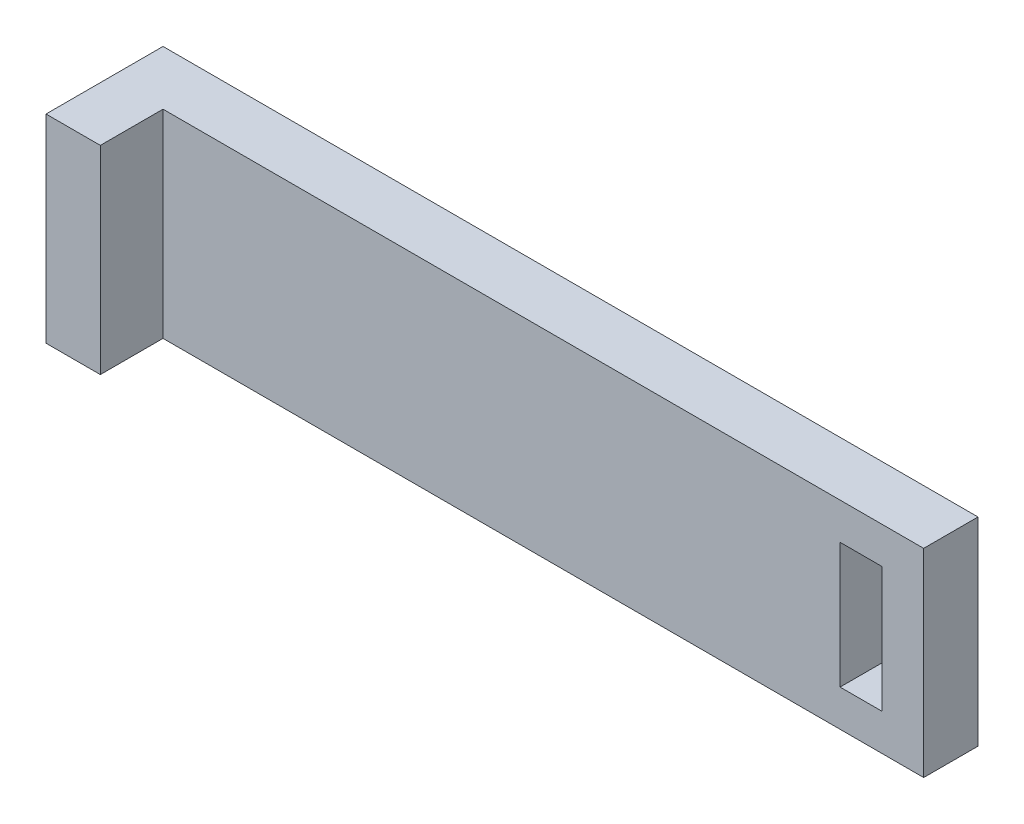
ISO-10303-21;
HEADER;
FILE_DESCRIPTION(('STEP AP214'),'2;1');
FILE_NAME('part.step','',(''),(''),'','','');
FILE_SCHEMA(('AUTOMOTIVE_DESIGN { 1 0 10303 214 1 1 1 1 }'));
ENDSEC;
DATA;
#1=APPLICATION_CONTEXT('core data for automotive mechanical design processes');
#2=APPLICATION_PROTOCOL_DEFINITION('international standard','automotive_design',2000,#1);
#3=PRODUCT_CONTEXT('',#1,'mechanical');
#4=PRODUCT('Part','Part','',(#3));
#5=PRODUCT_RELATED_PRODUCT_CATEGORY('part','',(#4));
#6=PRODUCT_DEFINITION_FORMATION('','',#4);
#7=PRODUCT_DEFINITION_CONTEXT('part definition',#1,'design');
#8=PRODUCT_DEFINITION('design','',#6,#7);
#9=PRODUCT_DEFINITION_SHAPE('','',#8);
#10=(LENGTH_UNIT() NAMED_UNIT(*) SI_UNIT(.MILLI.,.METRE.));
#11=(NAMED_UNIT(*) PLANE_ANGLE_UNIT() SI_UNIT($,.RADIAN.));
#12=(NAMED_UNIT(*) SI_UNIT($,.STERADIAN.) SOLID_ANGLE_UNIT());
#13=UNCERTAINTY_MEASURE_WITH_UNIT(LENGTH_MEASURE(1.E-05),#10,'distance_accuracy_value','');
#14=(GEOMETRIC_REPRESENTATION_CONTEXT(3) GLOBAL_UNCERTAINTY_ASSIGNED_CONTEXT((#13)) GLOBAL_UNIT_ASSIGNED_CONTEXT((#10,
#11,#12)) REPRESENTATION_CONTEXT('',''));
#15=CARTESIAN_POINT('',(0.,0.,0.));
#16=DIRECTION('',(0.,0.,1.));
#17=DIRECTION('',(1.,0.,0.));
#18=AXIS2_PLACEMENT_3D('',#15,#16,#17);
#19=CARTESIAN_POINT('',(-32.6418439716312,18.0585106382979,2.6));
#20=DIRECTION('',(1.,0.,0.));
#21=DIRECTION('',(0.,0.,-1.));
#22=AXIS2_PLACEMENT_3D('',#19,#20,#21);
#23=PLANE('',#22);
#24=DIRECTION('',(0.,-1.,0.));
#25=VECTOR('',#24,1.);
#26=CARTESIAN_POINT('',(-32.6418439716312,18.0585106382979,0.));
#27=LINE('',#26,#25);
#28=CARTESIAN_POINT('',(-32.6418439716312,18.0585106382979,0.));
#29=VERTEX_POINT('',#28);
#30=CARTESIAN_POINT('',(-32.6418439716312,8.55851063829788,0.));
#31=VERTEX_POINT('',#30);
#32=EDGE_CURVE('E168',#29,#31,#27,.T.);
#33=ORIENTED_EDGE('',*,*,#32,.T.);
#34=DIRECTION('',(0.,0.,-1.));
#35=VECTOR('',#34,1.);
#36=CARTESIAN_POINT('',(-32.6418439716312,8.55851063829788,2.6));
#37=LINE('',#36,#35);
#38=CARTESIAN_POINT('',(-32.6418439716312,8.55851063829788,5.6));
#39=VERTEX_POINT('',#38);
#40=EDGE_CURVE('E11',#39,#31,#37,.T.);
#41=ORIENTED_EDGE('',*,*,#40,.F.);
#42=DIRECTION('',(0.,-1.,0.));
#43=VECTOR('',#42,1.);
#44=CARTESIAN_POINT('',(-32.6418439716312,18.0585106382979,5.6));
#45=LINE('',#44,#43);
#46=CARTESIAN_POINT('',(-32.6418439716312,18.0585106382979,5.6));
#47=VERTEX_POINT('',#46);
#48=EDGE_CURVE('E150',#47,#39,#45,.T.);
#49=ORIENTED_EDGE('',*,*,#48,.F.);
#50=DIRECTION('',(0.,0.,-1.));
#51=VECTOR('',#50,1.);
#52=CARTESIAN_POINT('',(-32.6418439716312,18.0585106382979,2.6));
#53=LINE('',#52,#51);
#54=EDGE_CURVE('E176',#47,#29,#53,.T.);
#55=ORIENTED_EDGE('',*,*,#54,.T.);
#56=EDGE_LOOP('',(#33,#41,#49,#55));
#57=FACE_BOUND('',#56,.T.);
#58=ADVANCED_FACE('F38',(#57),#23,.F.);
#59=CARTESIAN_POINT('',(-32.6418439716312,8.55851063829788,2.6));
#60=DIRECTION('',(0.,1.,0.));
#61=DIRECTION('',(0.,0.,1.));
#62=AXIS2_PLACEMENT_3D('',#59,#60,#61);
#63=PLANE('',#62);
#64=DIRECTION('',(1.,0.,0.));
#65=VECTOR('',#64,1.);
#66=CARTESIAN_POINT('',(-32.6418439716312,8.55851063829788,0.));
#67=LINE('',#66,#65);
#68=CARTESIAN_POINT('',(6.35815602836879,8.55851063829788,0.));
#69=VERTEX_POINT('',#68);
#70=EDGE_CURVE('E179',#31,#69,#67,.T.);
#71=ORIENTED_EDGE('',*,*,#70,.T.);
#72=DIRECTION('',(0.,0.,-1.));
#73=VECTOR('',#72,1.);
#74=CARTESIAN_POINT('',(6.35815602836879,8.55851063829788,2.6));
#75=LINE('',#74,#73);
#76=CARTESIAN_POINT('',(6.35815602836879,8.55851063829788,2.6));
#77=VERTEX_POINT('',#76);
#78=EDGE_CURVE('E45',#77,#69,#75,.T.);
#79=ORIENTED_EDGE('',*,*,#78,.F.);
#80=DIRECTION('',(1.,0.,0.));
#81=VECTOR('',#80,1.);
#82=CARTESIAN_POINT('',(-32.6418439716312,8.55851063829788,2.6));
#83=LINE('',#82,#81);
#84=CARTESIAN_POINT('',(-30.0418439716312,8.55851063829788,2.6));
#85=VERTEX_POINT('',#84);
#86=EDGE_CURVE('E169',#85,#77,#83,.T.);
#87=ORIENTED_EDGE('',*,*,#86,.F.);
#88=DIRECTION('',(0.,0.,-1.));
#89=VECTOR('',#88,1.);
#90=CARTESIAN_POINT('',(-30.0418439716312,8.55851063829788,5.6));
#91=LINE('',#90,#89);
#92=CARTESIAN_POINT('',(-30.0418439716312,8.55851063829788,5.6));
#93=VERTEX_POINT('',#92);
#94=EDGE_CURVE('E165',#93,#85,#91,.T.);
#95=ORIENTED_EDGE('',*,*,#94,.F.);
#96=DIRECTION('',(1.,0.,0.));
#97=VECTOR('',#96,1.);
#98=CARTESIAN_POINT('',(-32.6418439716312,8.55851063829788,5.6));
#99=LINE('',#98,#97);
#100=EDGE_CURVE('E153',#39,#93,#99,.T.);
#101=ORIENTED_EDGE('',*,*,#100,.F.);
#102=ORIENTED_EDGE('',*,*,#40,.T.);
#103=EDGE_LOOP('',(#71,#79,#87,#95,#101,#102));
#104=FACE_BOUND('',#103,.T.);
#105=ADVANCED_FACE('F215',(#104),#63,.F.);
#106=CARTESIAN_POINT('',(6.35815602836879,18.0585106382979,2.6));
#107=DIRECTION('',(-1.,0.,0.));
#108=DIRECTION('',(0.,0.,1.));
#109=AXIS2_PLACEMENT_3D('',#106,#107,#108);
#110=PLANE('',#109);
#111=DIRECTION('',(0.,1.,0.));
#112=VECTOR('',#111,1.);
#113=CARTESIAN_POINT('',(6.35815602836879,18.0585106382979,0.));
#114=LINE('',#113,#112);
#115=CARTESIAN_POINT('',(6.35815602836879,18.0585106382979,0.));
#116=VERTEX_POINT('',#115);
#117=EDGE_CURVE('E181',#69,#116,#114,.T.);
#118=ORIENTED_EDGE('',*,*,#117,.T.);
#119=DIRECTION('',(0.,0.,-1.));
#120=VECTOR('',#119,1.);
#121=CARTESIAN_POINT('',(6.35815602836879,18.0585106382979,2.6));
#122=LINE('',#121,#120);
#123=CARTESIAN_POINT('',(6.35815602836879,18.0585106382979,2.6));
#124=VERTEX_POINT('',#123);
#125=EDGE_CURVE('E186',#124,#116,#122,.T.);
#126=ORIENTED_EDGE('',*,*,#125,.F.);
#127=DIRECTION('',(0.,1.,0.));
#128=VECTOR('',#127,1.);
#129=CARTESIAN_POINT('',(6.35815602836879,18.0585106382979,2.6));
#130=LINE('',#129,#128);
#131=EDGE_CURVE('E171',#77,#124,#130,.T.);
#132=ORIENTED_EDGE('',*,*,#131,.F.);
#133=ORIENTED_EDGE('',*,*,#78,.T.);
#134=EDGE_LOOP('',(#118,#126,#132,#133));
#135=FACE_BOUND('',#134,.T.);
#136=ADVANCED_FACE('F193',(#135),#110,.F.);
#137=CARTESIAN_POINT('',(-32.6418439716312,18.0585106382979,2.6));
#138=DIRECTION('',(0.,-1.,0.));
#139=DIRECTION('',(0.,0.,-1.));
#140=AXIS2_PLACEMENT_3D('',#137,#138,#139);
#141=PLANE('',#140);
#142=DIRECTION('',(-1.,0.,0.));
#143=VECTOR('',#142,1.);
#144=CARTESIAN_POINT('',(-32.6418439716312,18.0585106382979,0.));
#145=LINE('',#144,#143);
#146=EDGE_CURVE('E172',#116,#29,#145,.T.);
#147=ORIENTED_EDGE('',*,*,#146,.T.);
#148=ORIENTED_EDGE('',*,*,#54,.F.);
#149=DIRECTION('',(-1.,0.,0.));
#150=VECTOR('',#149,1.);
#151=CARTESIAN_POINT('',(-32.6418439716312,18.0585106382979,5.6));
#152=LINE('',#151,#150);
#153=CARTESIAN_POINT('',(-30.0418439716312,18.0585106382979,5.6));
#154=VERTEX_POINT('',#153);
#155=EDGE_CURVE('E157',#154,#47,#152,.T.);
#156=ORIENTED_EDGE('',*,*,#155,.F.);
#157=DIRECTION('',(0.,0.,-1.));
#158=VECTOR('',#157,1.);
#159=CARTESIAN_POINT('',(-30.0418439716312,18.0585106382979,5.6));
#160=LINE('',#159,#158);
#161=CARTESIAN_POINT('',(-30.0418439716312,18.0585106382979,2.6));
#162=VERTEX_POINT('',#161);
#163=EDGE_CURVE('E160',#154,#162,#160,.T.);
#164=ORIENTED_EDGE('',*,*,#163,.T.);
#165=DIRECTION('',(-1.,0.,0.));
#166=VECTOR('',#165,1.);
#167=CARTESIAN_POINT('',(-32.6418439716312,18.0585106382979,2.6));
#168=LINE('',#167,#166);
#169=EDGE_CURVE('E174',#124,#162,#168,.T.);
#170=ORIENTED_EDGE('',*,*,#169,.F.);
#171=ORIENTED_EDGE('',*,*,#125,.T.);
#172=EDGE_LOOP('',(#147,#148,#156,#164,#170,#171));
#173=FACE_BOUND('',#172,.T.);
#174=ADVANCED_FACE('F200',(#173),#141,.F.);
#175=CARTESIAN_POINT('',(0.,0.,2.6));
#176=DIRECTION('',(0.,0.,1.));
#177=DIRECTION('',(1.,0.,0.));
#178=AXIS2_PLACEMENT_3D('',#175,#176,#177);
#179=PLANE('',#178);
#180=DIRECTION('',(0.,-1.,0.));
#181=VECTOR('',#180,1.);
#182=CARTESIAN_POINT('',(2.35815602836879,0.,2.6));
#183=LINE('',#182,#181);
#184=CARTESIAN_POINT('',(2.35815602836879,16.3085106382979,2.6));
#185=VERTEX_POINT('',#184);
#186=CARTESIAN_POINT('',(2.35815602836879,10.3085106382979,2.6));
#187=VERTEX_POINT('',#186);
#188=EDGE_CURVE('E147',#185,#187,#183,.T.);
#189=ORIENTED_EDGE('',*,*,#188,.F.);
#190=DIRECTION('',(-1.,0.,0.));
#191=VECTOR('',#190,1.);
#192=CARTESIAN_POINT('',(0.,16.3085106382979,2.6));
#193=LINE('',#192,#191);
#194=CARTESIAN_POINT('',(4.35815602836879,16.3085106382979,2.6));
#195=VERTEX_POINT('',#194);
#196=EDGE_CURVE('E140',#195,#185,#193,.T.);
#197=ORIENTED_EDGE('',*,*,#196,.F.);
#198=DIRECTION('',(0.,1.,0.));
#199=VECTOR('',#198,1.);
#200=CARTESIAN_POINT('',(4.35815602836879,0.,2.6));
#201=LINE('',#200,#199);
#202=CARTESIAN_POINT('',(4.35815602836879,10.3085106382979,2.6));
#203=VERTEX_POINT('',#202);
#204=EDGE_CURVE('E120',#203,#195,#201,.T.);
#205=ORIENTED_EDGE('',*,*,#204,.F.);
#206=DIRECTION('',(1.,0.,0.));
#207=VECTOR('',#206,1.);
#208=CARTESIAN_POINT('',(0.,10.3085106382979,2.6));
#209=LINE('',#208,#207);
#210=EDGE_CURVE('E145',#187,#203,#209,.T.);
#211=ORIENTED_EDGE('',*,*,#210,.F.);
#212=EDGE_LOOP('',(#189,#197,#205,#211));
#213=FACE_BOUND('',#212,.T.);
#214=DIRECTION('',(0.,1.,0.));
#215=VECTOR('',#214,1.);
#216=CARTESIAN_POINT('',(-30.0418439716312,18.0585106382979,2.6));
#217=LINE('',#216,#215);
#218=EDGE_CURVE('E149',#85,#162,#217,.T.);
#219=ORIENTED_EDGE('',*,*,#218,.F.);
#220=ORIENTED_EDGE('',*,*,#86,.T.);
#221=ORIENTED_EDGE('',*,*,#131,.T.);
#222=ORIENTED_EDGE('',*,*,#169,.T.);
#223=EDGE_LOOP('',(#219,#220,#221,#222));
#224=FACE_BOUND('',#223,.T.);
#225=ADVANCED_FACE('F214',(#213,#224),#179,.T.);
#226=CARTESIAN_POINT('',(0.,0.,0.));
#227=DIRECTION('',(0.,0.,1.));
#228=DIRECTION('',(1.,0.,0.));
#229=AXIS2_PLACEMENT_3D('',#226,#227,#228);
#230=PLANE('',#229);
#231=DIRECTION('',(1.,0.,0.));
#232=VECTOR('',#231,1.);
#233=CARTESIAN_POINT('',(2.35815602836879,16.3085106382979,0.));
#234=LINE('',#233,#232);
#235=CARTESIAN_POINT('',(2.35815602836879,16.3085106382979,0.));
#236=VERTEX_POINT('',#235);
#237=CARTESIAN_POINT('',(4.35815602836879,16.3085106382979,0.));
#238=VERTEX_POINT('',#237);
#239=EDGE_CURVE('E126',#236,#238,#234,.T.);
#240=ORIENTED_EDGE('',*,*,#239,.F.);
#241=DIRECTION('',(0.,1.,0.));
#242=VECTOR('',#241,1.);
#243=CARTESIAN_POINT('',(2.35815602836879,10.3085106382979,0.));
#244=LINE('',#243,#242);
#245=CARTESIAN_POINT('',(2.35815602836879,10.3085106382979,0.));
#246=VERTEX_POINT('',#245);
#247=EDGE_CURVE('E60',#246,#236,#244,.T.);
#248=ORIENTED_EDGE('',*,*,#247,.F.);
#249=DIRECTION('',(-1.,0.,0.));
#250=VECTOR('',#249,1.);
#251=CARTESIAN_POINT('',(2.35815602836879,10.3085106382979,0.));
#252=LINE('',#251,#250);
#253=CARTESIAN_POINT('',(4.35815602836879,10.3085106382979,0.));
#254=VERTEX_POINT('',#253);
#255=EDGE_CURVE('E133',#254,#246,#252,.T.);
#256=ORIENTED_EDGE('',*,*,#255,.F.);
#257=DIRECTION('',(0.,-1.,0.));
#258=VECTOR('',#257,1.);
#259=CARTESIAN_POINT('',(4.35815602836879,10.3085106382979,0.));
#260=LINE('',#259,#258);
#261=EDGE_CURVE('E117',#238,#254,#260,.T.);
#262=ORIENTED_EDGE('',*,*,#261,.F.);
#263=EDGE_LOOP('',(#240,#248,#256,#262));
#264=FACE_BOUND('',#263,.T.);
#265=ORIENTED_EDGE('',*,*,#32,.F.);
#266=ORIENTED_EDGE('',*,*,#146,.F.);
#267=ORIENTED_EDGE('',*,*,#117,.F.);
#268=ORIENTED_EDGE('',*,*,#70,.F.);
#269=EDGE_LOOP('',(#265,#266,#267,#268));
#270=FACE_BOUND('',#269,.T.);
#271=ADVANCED_FACE('F130',(#264,#270),#230,.F.);
#272=CARTESIAN_POINT('',(-30.0418439716312,18.0585106382979,5.6));
#273=DIRECTION('',(-1.,0.,0.));
#274=DIRECTION('',(0.,0.,1.));
#275=AXIS2_PLACEMENT_3D('',#272,#273,#274);
#276=PLANE('',#275);
#277=ORIENTED_EDGE('',*,*,#218,.T.);
#278=ORIENTED_EDGE('',*,*,#163,.F.);
#279=DIRECTION('',(0.,1.,0.));
#280=VECTOR('',#279,1.);
#281=CARTESIAN_POINT('',(-30.0418439716312,18.0585106382979,5.6));
#282=LINE('',#281,#280);
#283=EDGE_CURVE('E155',#93,#154,#282,.T.);
#284=ORIENTED_EDGE('',*,*,#283,.F.);
#285=ORIENTED_EDGE('',*,*,#94,.T.);
#286=EDGE_LOOP('',(#277,#278,#284,#285));
#287=FACE_BOUND('',#286,.T.);
#288=ADVANCED_FACE('F212',(#287),#276,.F.);
#289=CARTESIAN_POINT('',(0.,0.,5.6));
#290=DIRECTION('',(0.,0.,1.));
#291=DIRECTION('',(1.,0.,0.));
#292=AXIS2_PLACEMENT_3D('',#289,#290,#291);
#293=PLANE('',#292);
#294=ORIENTED_EDGE('',*,*,#48,.T.);
#295=ORIENTED_EDGE('',*,*,#100,.T.);
#296=ORIENTED_EDGE('',*,*,#283,.T.);
#297=ORIENTED_EDGE('',*,*,#155,.T.);
#298=EDGE_LOOP('',(#294,#295,#296,#297));
#299=FACE_BOUND('',#298,.T.);
#300=ADVANCED_FACE('F207',(#299),#293,.T.);
#301=CARTESIAN_POINT('',(2.35815602836879,10.3085106382979,4.));
#302=DIRECTION('',(-1.,0.,0.));
#303=DIRECTION('',(0.,0.,1.));
#304=AXIS2_PLACEMENT_3D('',#301,#302,#303);
#305=PLANE('',#304);
#306=ORIENTED_EDGE('',*,*,#188,.T.);
#307=DIRECTION('',(0.,0.,-1.));
#308=VECTOR('',#307,1.);
#309=CARTESIAN_POINT('',(2.35815602836879,10.3085106382979,4.));
#310=LINE('',#309,#308);
#311=EDGE_CURVE('E138',#187,#246,#310,.T.);
#312=ORIENTED_EDGE('',*,*,#311,.T.);
#313=ORIENTED_EDGE('',*,*,#247,.T.);
#314=DIRECTION('',(0.,0.,-1.));
#315=VECTOR('',#314,1.);
#316=CARTESIAN_POINT('',(2.35815602836879,16.3085106382979,4.));
#317=LINE('',#316,#315);
#318=EDGE_CURVE('E123',#185,#236,#317,.T.);
#319=ORIENTED_EDGE('',*,*,#318,.F.);
#320=EDGE_LOOP('',(#306,#312,#313,#319));
#321=FACE_BOUND('',#320,.T.);
#322=ADVANCED_FACE('F234',(#321),#305,.F.);
#323=CARTESIAN_POINT('',(2.35815602836879,10.3085106382979,4.));
#324=DIRECTION('',(0.,-1.,0.));
#325=DIRECTION('',(0.,0.,-1.));
#326=AXIS2_PLACEMENT_3D('',#323,#324,#325);
#327=PLANE('',#326);
#328=ORIENTED_EDGE('',*,*,#210,.T.);
#329=DIRECTION('',(0.,0.,-1.));
#330=VECTOR('',#329,1.);
#331=CARTESIAN_POINT('',(4.35815602836879,10.3085106382979,4.));
#332=LINE('',#331,#330);
#333=EDGE_CURVE('E122',#203,#254,#332,.T.);
#334=ORIENTED_EDGE('',*,*,#333,.T.);
#335=ORIENTED_EDGE('',*,*,#255,.T.);
#336=ORIENTED_EDGE('',*,*,#311,.F.);
#337=EDGE_LOOP('',(#328,#334,#335,#336));
#338=FACE_BOUND('',#337,.T.);
#339=ADVANCED_FACE('F237',(#338),#327,.F.);
#340=CARTESIAN_POINT('',(4.35815602836879,10.3085106382979,4.));
#341=DIRECTION('',(1.,0.,0.));
#342=DIRECTION('',(0.,1.,0.));
#343=AXIS2_PLACEMENT_3D('',#340,#341,#342);
#344=PLANE('',#343);
#345=ORIENTED_EDGE('',*,*,#204,.T.);
#346=DIRECTION('',(0.,0.,-1.));
#347=VECTOR('',#346,1.);
#348=CARTESIAN_POINT('',(4.35815602836879,16.3085106382979,4.));
#349=LINE('',#348,#347);
#350=EDGE_CURVE('E52',#195,#238,#349,.T.);
#351=ORIENTED_EDGE('',*,*,#350,.T.);
#352=ORIENTED_EDGE('',*,*,#261,.T.);
#353=ORIENTED_EDGE('',*,*,#333,.F.);
#354=EDGE_LOOP('',(#345,#351,#352,#353));
#355=FACE_BOUND('',#354,.T.);
#356=ADVANCED_FACE('F114',(#355),#344,.F.);
#357=CARTESIAN_POINT('',(2.35815602836879,16.3085106382979,4.));
#358=DIRECTION('',(0.,1.,0.));
#359=DIRECTION('',(0.,0.,1.));
#360=AXIS2_PLACEMENT_3D('',#357,#358,#359);
#361=PLANE('',#360);
#362=ORIENTED_EDGE('',*,*,#196,.T.);
#363=ORIENTED_EDGE('',*,*,#318,.T.);
#364=ORIENTED_EDGE('',*,*,#239,.T.);
#365=ORIENTED_EDGE('',*,*,#350,.F.);
#366=EDGE_LOOP('',(#362,#363,#364,#365));
#367=FACE_BOUND('',#366,.T.);
#368=ADVANCED_FACE('F127',(#367),#361,.F.);
#369=CLOSED_SHELL('',(#58,#105,#136,#174,#225,#271,#288,#300,#322,#339,#356,#368));
#370=MANIFOLD_SOLID_BREP('B2',#369);
#371=ADVANCED_BREP_SHAPE_REPRESENTATION('',(#18,#370),#14);
#372=SHAPE_DEFINITION_REPRESENTATION(#9,#371);
ENDSEC;
END-ISO-10303-21;
